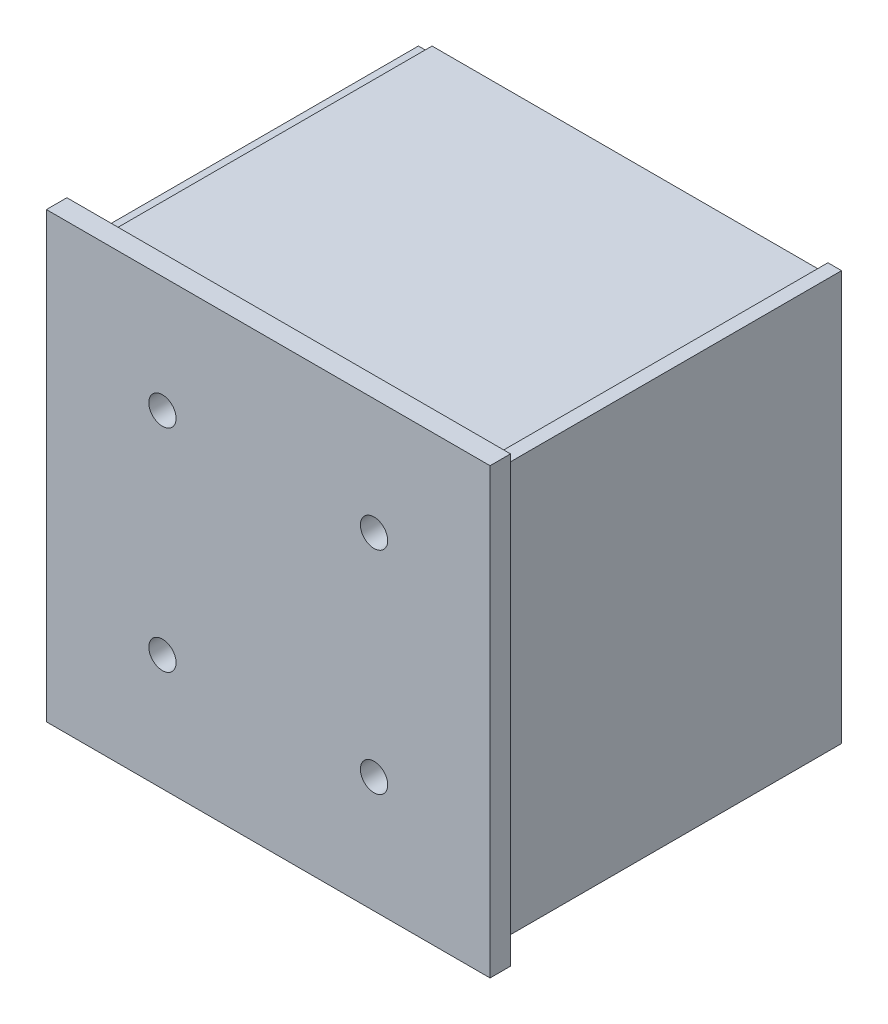
ISO-10303-21;
HEADER;
FILE_DESCRIPTION(('STEP AP214'),'2;1');
FILE_NAME('part.step','',(''),(''),'','','');
FILE_SCHEMA(('AUTOMOTIVE_DESIGN { 1 0 10303 214 1 1 1 1 }'));
ENDSEC;
DATA;
#1=APPLICATION_CONTEXT('core data for automotive mechanical design processes');
#2=APPLICATION_PROTOCOL_DEFINITION('international standard','automotive_design',2000,#1);
#3=PRODUCT_CONTEXT('',#1,'mechanical');
#4=PRODUCT('Part','Part','',(#3));
#5=PRODUCT_RELATED_PRODUCT_CATEGORY('part','',(#4));
#6=PRODUCT_DEFINITION_FORMATION('','',#4);
#7=PRODUCT_DEFINITION_CONTEXT('part definition',#1,'design');
#8=PRODUCT_DEFINITION('design','',#6,#7);
#9=PRODUCT_DEFINITION_SHAPE('','',#8);
#10=(LENGTH_UNIT() NAMED_UNIT(*) SI_UNIT(.MILLI.,.METRE.));
#11=(NAMED_UNIT(*) PLANE_ANGLE_UNIT() SI_UNIT($,.RADIAN.));
#12=(NAMED_UNIT(*) SI_UNIT($,.STERADIAN.) SOLID_ANGLE_UNIT());
#13=UNCERTAINTY_MEASURE_WITH_UNIT(LENGTH_MEASURE(1.E-05),#10,'distance_accuracy_value','');
#14=(GEOMETRIC_REPRESENTATION_CONTEXT(3) GLOBAL_UNCERTAINTY_ASSIGNED_CONTEXT((#13)) GLOBAL_UNIT_ASSIGNED_CONTEXT((#10,
#11,#12)) REPRESENTATION_CONTEXT('',''));
#15=CARTESIAN_POINT('',(0.,0.,0.));
#16=DIRECTION('',(0.,0.,1.));
#17=DIRECTION('',(1.,0.,0.));
#18=AXIS2_PLACEMENT_3D('',#15,#16,#17);
#19=CARTESIAN_POINT('',(0.,0.,0.));
#20=DIRECTION('',(0.,0.,1.));
#21=DIRECTION('',(1.,0.,0.));
#22=AXIS2_PLACEMENT_3D('',#19,#20,#21);
#23=PLANE('',#22);
#24=CARTESIAN_POINT('',(-15.5,15.5,0.));
#25=DIRECTION('',(0.,0.,1.));
#26=DIRECTION('',(1.,0.,0.));
#27=AXIS2_PLACEMENT_3D('',#24,#25,#26);
#28=CIRCLE('',#27,2.);
#29=CARTESIAN_POINT('',(-13.5,15.5,0.));
#30=VERTEX_POINT('',#29);
#31=EDGE_CURVE('E379',#30,#30,#28,.T.);
#32=ORIENTED_EDGE('',*,*,#31,.T.);
#33=EDGE_LOOP('',(#32));
#34=FACE_BOUND('',#33,.T.);
#35=CARTESIAN_POINT('',(15.5,15.5,0.));
#36=DIRECTION('',(0.,0.,1.));
#37=DIRECTION('',(1.,0.,0.));
#38=AXIS2_PLACEMENT_3D('',#35,#36,#37);
#39=CIRCLE('',#38,2.00000000000001);
#40=CARTESIAN_POINT('',(17.5,15.5,0.));
#41=VERTEX_POINT('',#40);
#42=EDGE_CURVE('E371',#41,#41,#39,.T.);
#43=ORIENTED_EDGE('',*,*,#42,.T.);
#44=EDGE_LOOP('',(#43));
#45=FACE_BOUND('',#44,.T.);
#46=CARTESIAN_POINT('',(15.5,-15.5,0.));
#47=DIRECTION('',(0.,0.,1.));
#48=DIRECTION('',(1.,0.,0.));
#49=AXIS2_PLACEMENT_3D('',#46,#47,#48);
#50=CIRCLE('',#49,2.00000000000001);
#51=CARTESIAN_POINT('',(17.5,-15.5,0.));
#52=VERTEX_POINT('',#51);
#53=EDGE_CURVE('E363',#52,#52,#50,.T.);
#54=ORIENTED_EDGE('',*,*,#53,.T.);
#55=EDGE_LOOP('',(#54));
#56=FACE_BOUND('',#55,.T.);
#57=CARTESIAN_POINT('',(-15.5,-15.5,0.));
#58=DIRECTION('',(0.,0.,1.));
#59=DIRECTION('',(1.,0.,0.));
#60=AXIS2_PLACEMENT_3D('',#57,#58,#59);
#61=CIRCLE('',#60,2.);
#62=CARTESIAN_POINT('',(-13.5,-15.5,0.));
#63=VERTEX_POINT('',#62);
#64=EDGE_CURVE('E350',#63,#63,#61,.T.);
#65=ORIENTED_EDGE('',*,*,#64,.T.);
#66=EDGE_LOOP('',(#65));
#67=FACE_BOUND('',#66,.T.);
#68=DIRECTION('',(-1.,0.,0.));
#69=VECTOR('',#68,1.);
#70=CARTESIAN_POINT('',(0.,26.5,0.));
#71=LINE('',#70,#69);
#72=CARTESIAN_POINT('',(29.,26.5,0.));
#73=VERTEX_POINT('',#72);
#74=CARTESIAN_POINT('',(-29.,26.5,0.));
#75=VERTEX_POINT('',#74);
#76=EDGE_CURVE('E203',#73,#75,#71,.T.);
#77=ORIENTED_EDGE('',*,*,#76,.F.);
#78=DIRECTION('',(0.,1.,0.));
#79=VECTOR('',#78,1.);
#80=CARTESIAN_POINT('',(29.,0.,0.));
#81=LINE('',#80,#79);
#82=CARTESIAN_POINT('',(29.,-26.5,0.));
#83=VERTEX_POINT('',#82);
#84=EDGE_CURVE('E264',#83,#73,#81,.T.);
#85=ORIENTED_EDGE('',*,*,#84,.F.);
#86=DIRECTION('',(-1.,0.,0.));
#87=VECTOR('',#86,1.);
#88=CARTESIAN_POINT('',(0.,-26.5,0.));
#89=LINE('',#88,#87);
#90=CARTESIAN_POINT('',(-29.,-26.5,0.));
#91=VERTEX_POINT('',#90);
#92=EDGE_CURVE('E68',#83,#91,#89,.T.);
#93=ORIENTED_EDGE('',*,*,#92,.T.);
#94=DIRECTION('',(0.,1.,0.));
#95=VECTOR('',#94,1.);
#96=CARTESIAN_POINT('',(-29.,0.,0.));
#97=LINE('',#96,#95);
#98=EDGE_CURVE('E63',#91,#75,#97,.T.);
#99=ORIENTED_EDGE('',*,*,#98,.T.);
#100=EDGE_LOOP('',(#77,#85,#93,#99));
#101=FACE_BOUND('',#100,.T.);
#102=ADVANCED_FACE('F47',(#34,#45,#56,#67,#101),#23,.F.);
#103=CARTESIAN_POINT('',(0.,0.,3.));
#104=DIRECTION('',(0.,0.,1.));
#105=DIRECTION('',(1.,0.,0.));
#106=AXIS2_PLACEMENT_3D('',#103,#104,#105);
#107=PLANE('',#106);
#108=CARTESIAN_POINT('',(15.5,-15.5,3.));
#109=DIRECTION('',(0.,0.,1.));
#110=DIRECTION('',(1.,0.,0.));
#111=AXIS2_PLACEMENT_3D('',#108,#109,#110);
#112=CIRCLE('',#111,2.00000000000001);
#113=CARTESIAN_POINT('',(17.5,-15.5,3.));
#114=VERTEX_POINT('',#113);
#115=EDGE_CURVE('E367',#114,#114,#112,.T.);
#116=ORIENTED_EDGE('',*,*,#115,.F.);
#117=EDGE_LOOP('',(#116));
#118=FACE_BOUND('',#117,.T.);
#119=CARTESIAN_POINT('',(-15.5,15.5,3.));
#120=DIRECTION('',(0.,0.,1.));
#121=DIRECTION('',(1.,0.,0.));
#122=AXIS2_PLACEMENT_3D('',#119,#120,#121);
#123=CIRCLE('',#122,2.);
#124=CARTESIAN_POINT('',(-13.5,15.5,3.));
#125=VERTEX_POINT('',#124);
#126=EDGE_CURVE('E383',#125,#125,#123,.T.);
#127=ORIENTED_EDGE('',*,*,#126,.F.);
#128=EDGE_LOOP('',(#127));
#129=FACE_BOUND('',#128,.T.);
#130=DIRECTION('',(0.,1.,0.));
#131=VECTOR('',#130,1.);
#132=CARTESIAN_POINT('',(32.5,32.5,3.));
#133=LINE('',#132,#131);
#134=CARTESIAN_POINT('',(32.5,-32.5,3.));
#135=VERTEX_POINT('',#134);
#136=CARTESIAN_POINT('',(32.5,32.5,3.));
#137=VERTEX_POINT('',#136);
#138=EDGE_CURVE('E391',#135,#137,#133,.T.);
#139=ORIENTED_EDGE('',*,*,#138,.T.);
#140=DIRECTION('',(-1.,0.,0.));
#141=VECTOR('',#140,1.);
#142=CARTESIAN_POINT('',(-32.5,32.5,3.));
#143=LINE('',#142,#141);
#144=CARTESIAN_POINT('',(-32.5,32.5,3.));
#145=VERTEX_POINT('',#144);
#146=EDGE_CURVE('E395',#137,#145,#143,.T.);
#147=ORIENTED_EDGE('',*,*,#146,.T.);
#148=DIRECTION('',(0.,-1.,0.));
#149=VECTOR('',#148,1.);
#150=CARTESIAN_POINT('',(-32.5,32.5,3.));
#151=LINE('',#150,#149);
#152=CARTESIAN_POINT('',(-32.5,-32.5,3.));
#153=VERTEX_POINT('',#152);
#154=EDGE_CURVE('E399',#145,#153,#151,.T.);
#155=ORIENTED_EDGE('',*,*,#154,.T.);
#156=DIRECTION('',(1.,0.,0.));
#157=VECTOR('',#156,1.);
#158=CARTESIAN_POINT('',(-32.5,-32.5,3.));
#159=LINE('',#158,#157);
#160=EDGE_CURVE('E402',#153,#135,#159,.T.);
#161=ORIENTED_EDGE('',*,*,#160,.T.);
#162=EDGE_LOOP('',(#139,#147,#155,#161));
#163=FACE_BOUND('',#162,.T.);
#164=CARTESIAN_POINT('',(15.5,15.5,3.));
#165=DIRECTION('',(0.,0.,1.));
#166=DIRECTION('',(1.,0.,0.));
#167=AXIS2_PLACEMENT_3D('',#164,#165,#166);
#168=CIRCLE('',#167,2.00000000000001);
#169=CARTESIAN_POINT('',(17.5,15.5,3.));
#170=VERTEX_POINT('',#169);
#171=EDGE_CURVE('E375',#170,#170,#168,.T.);
#172=ORIENTED_EDGE('',*,*,#171,.F.);
#173=EDGE_LOOP('',(#172));
#174=FACE_BOUND('',#173,.T.);
#175=CARTESIAN_POINT('',(-15.5,-15.5,3.));
#176=DIRECTION('',(0.,0.,1.));
#177=DIRECTION('',(1.,0.,0.));
#178=AXIS2_PLACEMENT_3D('',#175,#176,#177);
#179=CIRCLE('',#178,2.);
#180=CARTESIAN_POINT('',(-13.5,-15.5,3.));
#181=VERTEX_POINT('',#180);
#182=EDGE_CURVE('E359',#181,#181,#179,.T.);
#183=ORIENTED_EDGE('',*,*,#182,.F.);
#184=EDGE_LOOP('',(#183));
#185=FACE_BOUND('',#184,.T.);
#186=ADVANCED_FACE('F444',(#118,#129,#163,#174,#185),#107,.T.);
#187=DIRECTION('',(1.,0.,0.));
#188=VECTOR('',#187,1.);
#189=CARTESIAN_POINT('',(0.,-30.,0.));
#190=LINE('',#189,#188);
#191=CARTESIAN_POINT('',(29.,-30.,0.));
#192=VERTEX_POINT('',#191);
#193=CARTESIAN_POINT('',(31.,-30.,0.));
#194=VERTEX_POINT('',#193);
#195=EDGE_CURVE('E273',#192,#194,#190,.T.);
#196=ORIENTED_EDGE('',*,*,#195,.T.);
#197=DIRECTION('',(0.,1.,0.));
#198=VECTOR('',#197,1.);
#199=CARTESIAN_POINT('',(31.,0.,0.));
#200=LINE('',#199,#198);
#201=CARTESIAN_POINT('',(31.,30.,0.));
#202=VERTEX_POINT('',#201);
#203=EDGE_CURVE('E268',#194,#202,#200,.T.);
#204=ORIENTED_EDGE('',*,*,#203,.T.);
#205=DIRECTION('',(1.,0.,0.));
#206=VECTOR('',#205,1.);
#207=CARTESIAN_POINT('',(0.,30.,0.));
#208=LINE('',#207,#206);
#209=CARTESIAN_POINT('',(29.,30.,0.));
#210=VERTEX_POINT('',#209);
#211=EDGE_CURVE('E198',#210,#202,#208,.T.);
#212=ORIENTED_EDGE('',*,*,#211,.F.);
#213=CARTESIAN_POINT('',(29.,28.5,0.));
#214=VERTEX_POINT('',#213);
#215=EDGE_CURVE('E269',#214,#210,#81,.T.);
#216=ORIENTED_EDGE('',*,*,#215,.F.);
#217=DIRECTION('',(-1.,0.,0.));
#218=VECTOR('',#217,1.);
#219=CARTESIAN_POINT('',(0.,28.5,0.));
#220=LINE('',#219,#218);
#221=CARTESIAN_POINT('',(-29.,28.5,0.));
#222=VERTEX_POINT('',#221);
#223=EDGE_CURVE('E297',#214,#222,#220,.T.);
#224=ORIENTED_EDGE('',*,*,#223,.T.);
#225=DIRECTION('',(0.,-1.,0.));
#226=VECTOR('',#225,1.);
#227=CARTESIAN_POINT('',(-29.,0.,0.));
#228=LINE('',#227,#226);
#229=CARTESIAN_POINT('',(-29.,27.5,0.));
#230=VERTEX_POINT('',#229);
#231=EDGE_CURVE('E294',#222,#230,#228,.T.);
#232=ORIENTED_EDGE('',*,*,#231,.T.);
#233=DIRECTION('',(1.,0.,0.));
#234=VECTOR('',#233,1.);
#235=CARTESIAN_POINT('',(0.,27.5,0.));
#236=LINE('',#235,#234);
#237=CARTESIAN_POINT('',(-31.,27.5,0.));
#238=VERTEX_POINT('',#237);
#239=EDGE_CURVE('E290',#238,#230,#236,.T.);
#240=ORIENTED_EDGE('',*,*,#239,.F.);
#241=DIRECTION('',(0.,1.,0.));
#242=VECTOR('',#241,1.);
#243=CARTESIAN_POINT('',(-31.,0.,0.));
#244=LINE('',#243,#242);
#245=CARTESIAN_POINT('',(-31.,-27.5,0.));
#246=VERTEX_POINT('',#245);
#247=EDGE_CURVE('E286',#246,#238,#244,.T.);
#248=ORIENTED_EDGE('',*,*,#247,.F.);
#249=DIRECTION('',(1.,0.,0.));
#250=VECTOR('',#249,1.);
#251=CARTESIAN_POINT('',(0.,-27.5,0.));
#252=LINE('',#251,#250);
#253=CARTESIAN_POINT('',(-29.,-27.5,0.));
#254=VERTEX_POINT('',#253);
#255=EDGE_CURVE('E283',#246,#254,#252,.T.);
#256=ORIENTED_EDGE('',*,*,#255,.T.);
#257=DIRECTION('',(0.,-1.,0.));
#258=VECTOR('',#257,1.);
#259=CARTESIAN_POINT('',(-29.,0.,0.));
#260=LINE('',#259,#258);
#261=CARTESIAN_POINT('',(-29.,-28.5,0.));
#262=VERTEX_POINT('',#261);
#263=EDGE_CURVE('E280',#254,#262,#260,.T.);
#264=ORIENTED_EDGE('',*,*,#263,.T.);
#265=DIRECTION('',(-1.,0.,0.));
#266=VECTOR('',#265,1.);
#267=CARTESIAN_POINT('',(0.,-28.5,0.));
#268=LINE('',#267,#266);
#269=CARTESIAN_POINT('',(29.,-28.5,0.));
#270=VERTEX_POINT('',#269);
#271=EDGE_CURVE('E276',#270,#262,#268,.T.);
#272=ORIENTED_EDGE('',*,*,#271,.F.);
#273=EDGE_CURVE('E270',#192,#270,#81,.T.);
#274=ORIENTED_EDGE('',*,*,#273,.F.);
#275=EDGE_LOOP('',(#196,#204,#212,#216,#224,#232,#240,#248,#256,#264,#272,#274));
#276=FACE_BOUND('',#275,.T.);
#277=DIRECTION('',(0.,1.,0.));
#278=VECTOR('',#277,1.);
#279=CARTESIAN_POINT('',(32.5,32.5,0.));
#280=LINE('',#279,#278);
#281=CARTESIAN_POINT('',(32.5,-32.5,0.));
#282=VERTEX_POINT('',#281);
#283=CARTESIAN_POINT('',(32.5,32.5,0.));
#284=VERTEX_POINT('',#283);
#285=EDGE_CURVE('E387',#282,#284,#280,.T.);
#286=ORIENTED_EDGE('',*,*,#285,.F.);
#287=DIRECTION('',(1.,0.,0.));
#288=VECTOR('',#287,1.);
#289=CARTESIAN_POINT('',(-32.5,-32.5,0.));
#290=LINE('',#289,#288);
#291=CARTESIAN_POINT('',(-32.5,-32.5,0.));
#292=VERTEX_POINT('',#291);
#293=EDGE_CURVE('E396',#292,#282,#290,.T.);
#294=ORIENTED_EDGE('',*,*,#293,.F.);
#295=DIRECTION('',(0.,-1.,0.));
#296=VECTOR('',#295,1.);
#297=CARTESIAN_POINT('',(-32.5,32.5,0.));
#298=LINE('',#297,#296);
#299=CARTESIAN_POINT('',(-32.5,32.5,0.));
#300=VERTEX_POINT('',#299);
#301=EDGE_CURVE('E412',#300,#292,#298,.T.);
#302=ORIENTED_EDGE('',*,*,#301,.F.);
#303=DIRECTION('',(-1.,0.,0.));
#304=VECTOR('',#303,1.);
#305=CARTESIAN_POINT('',(-32.5,32.5,0.));
#306=LINE('',#305,#304);
#307=EDGE_CURVE('E409',#284,#300,#306,.T.);
#308=ORIENTED_EDGE('',*,*,#307,.F.);
#309=EDGE_LOOP('',(#286,#294,#302,#308));
#310=FACE_BOUND('',#309,.T.);
#311=ADVANCED_FACE('F435',(#276,#310),#23,.F.);
#312=CARTESIAN_POINT('',(32.5,32.5,3.));
#313=DIRECTION('',(-1.,0.,0.));
#314=DIRECTION('',(0.,0.,1.));
#315=AXIS2_PLACEMENT_3D('',#312,#313,#314);
#316=PLANE('',#315);
#317=ORIENTED_EDGE('',*,*,#285,.T.);
#318=DIRECTION('',(0.,0.,-1.));
#319=VECTOR('',#318,1.);
#320=CARTESIAN_POINT('',(32.5,32.5,3.));
#321=LINE('',#320,#319);
#322=EDGE_CURVE('E11',#137,#284,#321,.T.);
#323=ORIENTED_EDGE('',*,*,#322,.F.);
#324=ORIENTED_EDGE('',*,*,#138,.F.);
#325=DIRECTION('',(0.,0.,-1.));
#326=VECTOR('',#325,1.);
#327=CARTESIAN_POINT('',(32.5,-32.5,3.));
#328=LINE('',#327,#326);
#329=EDGE_CURVE('E405',#135,#282,#328,.T.);
#330=ORIENTED_EDGE('',*,*,#329,.T.);
#331=EDGE_LOOP('',(#317,#323,#324,#330));
#332=FACE_BOUND('',#331,.T.);
#333=ADVANCED_FACE('F49',(#332),#316,.F.);
#334=CARTESIAN_POINT('',(-32.5,32.5,3.));
#335=DIRECTION('',(0.,-1.,0.));
#336=DIRECTION('',(0.,0.,-1.));
#337=AXIS2_PLACEMENT_3D('',#334,#335,#336);
#338=PLANE('',#337);
#339=ORIENTED_EDGE('',*,*,#307,.T.);
#340=DIRECTION('',(0.,0.,-1.));
#341=VECTOR('',#340,1.);
#342=CARTESIAN_POINT('',(-32.5,32.5,3.));
#343=LINE('',#342,#341);
#344=EDGE_CURVE('E56',#145,#300,#343,.T.);
#345=ORIENTED_EDGE('',*,*,#344,.F.);
#346=ORIENTED_EDGE('',*,*,#146,.F.);
#347=ORIENTED_EDGE('',*,*,#322,.T.);
#348=EDGE_LOOP('',(#339,#345,#346,#347));
#349=FACE_BOUND('',#348,.T.);
#350=ADVANCED_FACE('F446',(#349),#338,.F.);
#351=CARTESIAN_POINT('',(-32.5,32.5,3.));
#352=DIRECTION('',(1.,0.,0.));
#353=DIRECTION('',(0.,0.,-1.));
#354=AXIS2_PLACEMENT_3D('',#351,#352,#353);
#355=PLANE('',#354);
#356=ORIENTED_EDGE('',*,*,#301,.T.);
#357=DIRECTION('',(0.,0.,-1.));
#358=VECTOR('',#357,1.);
#359=CARTESIAN_POINT('',(-32.5,-32.5,3.));
#360=LINE('',#359,#358);
#361=EDGE_CURVE('E420',#153,#292,#360,.T.);
#362=ORIENTED_EDGE('',*,*,#361,.F.);
#363=ORIENTED_EDGE('',*,*,#154,.F.);
#364=ORIENTED_EDGE('',*,*,#344,.T.);
#365=EDGE_LOOP('',(#356,#362,#363,#364));
#366=FACE_BOUND('',#365,.T.);
#367=ADVANCED_FACE('F429',(#366),#355,.F.);
#368=CARTESIAN_POINT('',(-32.5,-32.5,3.));
#369=DIRECTION('',(0.,1.,0.));
#370=DIRECTION('',(0.,0.,1.));
#371=AXIS2_PLACEMENT_3D('',#368,#369,#370);
#372=PLANE('',#371);
#373=ORIENTED_EDGE('',*,*,#293,.T.);
#374=ORIENTED_EDGE('',*,*,#329,.F.);
#375=ORIENTED_EDGE('',*,*,#160,.F.);
#376=ORIENTED_EDGE('',*,*,#361,.T.);
#377=EDGE_LOOP('',(#373,#374,#375,#376));
#378=FACE_BOUND('',#377,.T.);
#379=ADVANCED_FACE('F438',(#378),#372,.F.);
#380=CARTESIAN_POINT('',(-15.5,15.5,3.));
#381=DIRECTION('',(0.,0.,-1.));
#382=DIRECTION('',(-1.,0.,0.));
#383=AXIS2_PLACEMENT_3D('',#380,#381,#382);
#384=CYLINDRICAL_SURFACE('',#383,2.);
#385=ORIENTED_EDGE('',*,*,#126,.T.);
#386=EDGE_LOOP('',(#385));
#387=FACE_BOUND('',#386,.T.);
#388=ORIENTED_EDGE('',*,*,#31,.F.);
#389=EDGE_LOOP('',(#388));
#390=FACE_BOUND('',#389,.T.);
#391=ADVANCED_FACE('F567',(#387,#390),#384,.F.);
#392=CARTESIAN_POINT('',(15.5,15.5,3.));
#393=DIRECTION('',(0.,0.,-1.));
#394=DIRECTION('',(-1.,0.,0.));
#395=AXIS2_PLACEMENT_3D('',#392,#393,#394);
#396=CYLINDRICAL_SURFACE('',#395,2.00000000000001);
#397=ORIENTED_EDGE('',*,*,#171,.T.);
#398=EDGE_LOOP('',(#397));
#399=FACE_BOUND('',#398,.T.);
#400=ORIENTED_EDGE('',*,*,#42,.F.);
#401=EDGE_LOOP('',(#400));
#402=FACE_BOUND('',#401,.T.);
#403=ADVANCED_FACE('F563',(#399,#402),#396,.F.);
#404=CARTESIAN_POINT('',(15.5,-15.5,3.));
#405=DIRECTION('',(0.,0.,-1.));
#406=DIRECTION('',(-1.,0.,0.));
#407=AXIS2_PLACEMENT_3D('',#404,#405,#406);
#408=CYLINDRICAL_SURFACE('',#407,2.00000000000001);
#409=ORIENTED_EDGE('',*,*,#115,.T.);
#410=EDGE_LOOP('',(#409));
#411=FACE_BOUND('',#410,.T.);
#412=ORIENTED_EDGE('',*,*,#53,.F.);
#413=EDGE_LOOP('',(#412));
#414=FACE_BOUND('',#413,.T.);
#415=ADVANCED_FACE('F559',(#411,#414),#408,.F.);
#416=CARTESIAN_POINT('',(-15.5,-15.5,3.));
#417=DIRECTION('',(0.,0.,-1.));
#418=DIRECTION('',(-1.,0.,0.));
#419=AXIS2_PLACEMENT_3D('',#416,#417,#418);
#420=CYLINDRICAL_SURFACE('',#419,2.);
#421=ORIENTED_EDGE('',*,*,#182,.T.);
#422=EDGE_LOOP('',(#421));
#423=FACE_BOUND('',#422,.T.);
#424=ORIENTED_EDGE('',*,*,#64,.F.);
#425=EDGE_LOOP('',(#424));
#426=FACE_BOUND('',#425,.T.);
#427=ADVANCED_FACE('F549',(#423,#426),#420,.F.);
#428=CARTESIAN_POINT('',(31.,0.,-50.));
#429=DIRECTION('',(1.,0.,0.));
#430=DIRECTION('',(0.,0.,-1.));
#431=AXIS2_PLACEMENT_3D('',#428,#429,#430);
#432=PLANE('',#431);
#433=ORIENTED_EDGE('',*,*,#203,.F.);
#434=DIRECTION('',(0.,0.,1.));
#435=VECTOR('',#434,1.);
#436=CARTESIAN_POINT('',(31.,-30.,-50.));
#437=LINE('',#436,#435);
#438=CARTESIAN_POINT('',(31.,-30.,-50.));
#439=VERTEX_POINT('',#438);
#440=EDGE_CURVE('E346',#439,#194,#437,.T.);
#441=ORIENTED_EDGE('',*,*,#440,.F.);
#442=DIRECTION('',(0.,1.,0.));
#443=VECTOR('',#442,1.);
#444=CARTESIAN_POINT('',(31.,0.,-50.));
#445=LINE('',#444,#443);
#446=CARTESIAN_POINT('',(31.,30.,-50.));
#447=VERTEX_POINT('',#446);
#448=EDGE_CURVE('E218',#439,#447,#445,.T.);
#449=ORIENTED_EDGE('',*,*,#448,.T.);
#450=DIRECTION('',(0.,0.,1.));
#451=VECTOR('',#450,1.);
#452=CARTESIAN_POINT('',(31.,30.,-50.));
#453=LINE('',#452,#451);
#454=EDGE_CURVE('E206',#447,#202,#453,.T.);
#455=ORIENTED_EDGE('',*,*,#454,.T.);
#456=EDGE_LOOP('',(#433,#441,#449,#455));
#457=FACE_BOUND('',#456,.T.);
#458=ADVANCED_FACE('F477',(#457),#432,.T.);
#459=CARTESIAN_POINT('',(0.,-30.,-50.));
#460=DIRECTION('',(0.,-1.,0.));
#461=DIRECTION('',(0.,0.,-1.));
#462=AXIS2_PLACEMENT_3D('',#459,#460,#461);
#463=PLANE('',#462);
#464=ORIENTED_EDGE('',*,*,#195,.F.);
#465=DIRECTION('',(0.,0.,1.));
#466=VECTOR('',#465,1.);
#467=CARTESIAN_POINT('',(29.,-30.,-50.));
#468=LINE('',#467,#466);
#469=CARTESIAN_POINT('',(29.,-30.,-50.));
#470=VERTEX_POINT('',#469);
#471=EDGE_CURVE('E342',#470,#192,#468,.T.);
#472=ORIENTED_EDGE('',*,*,#471,.F.);
#473=DIRECTION('',(1.,0.,0.));
#474=VECTOR('',#473,1.);
#475=CARTESIAN_POINT('',(0.,-30.,-50.));
#476=LINE('',#475,#474);
#477=EDGE_CURVE('E224',#470,#439,#476,.T.);
#478=ORIENTED_EDGE('',*,*,#477,.T.);
#479=ORIENTED_EDGE('',*,*,#440,.T.);
#480=EDGE_LOOP('',(#464,#472,#478,#479));
#481=FACE_BOUND('',#480,.T.);
#482=ADVANCED_FACE('F473',(#481),#463,.T.);
#483=CARTESIAN_POINT('',(29.,0.,-50.));
#484=DIRECTION('',(1.,0.,0.));
#485=DIRECTION('',(0.,0.,-1.));
#486=AXIS2_PLACEMENT_3D('',#483,#484,#485);
#487=PLANE('',#486);
#488=ORIENTED_EDGE('',*,*,#273,.T.);
#489=DIRECTION('',(0.,0.,1.));
#490=VECTOR('',#489,1.);
#491=CARTESIAN_POINT('',(29.,-28.5,-50.));
#492=LINE('',#491,#490);
#493=CARTESIAN_POINT('',(29.,-28.5,-50.));
#494=VERTEX_POINT('',#493);
#495=EDGE_CURVE('E338',#494,#270,#492,.T.);
#496=ORIENTED_EDGE('',*,*,#495,.F.);
#497=DIRECTION('',(0.,1.,0.));
#498=VECTOR('',#497,1.);
#499=CARTESIAN_POINT('',(29.,0.,-50.));
#500=LINE('',#499,#498);
#501=EDGE_CURVE('E220',#470,#494,#500,.T.);
#502=ORIENTED_EDGE('',*,*,#501,.F.);
#503=ORIENTED_EDGE('',*,*,#471,.T.);
#504=EDGE_LOOP('',(#488,#496,#502,#503));
#505=FACE_BOUND('',#504,.T.);
#506=ADVANCED_FACE('F518',(#505),#487,.F.);
#507=CARTESIAN_POINT('',(0.,-28.5,-50.));
#508=DIRECTION('',(0.,1.,0.));
#509=DIRECTION('',(0.,0.,1.));
#510=AXIS2_PLACEMENT_3D('',#507,#508,#509);
#511=PLANE('',#510);
#512=ORIENTED_EDGE('',*,*,#271,.T.);
#513=DIRECTION('',(0.,0.,1.));
#514=VECTOR('',#513,1.);
#515=CARTESIAN_POINT('',(-29.,-28.5,-50.));
#516=LINE('',#515,#514);
#517=CARTESIAN_POINT('',(-29.,-28.5,-50.));
#518=VERTEX_POINT('',#517);
#519=EDGE_CURVE('E334',#518,#262,#516,.T.);
#520=ORIENTED_EDGE('',*,*,#519,.F.);
#521=DIRECTION('',(-1.,0.,0.));
#522=VECTOR('',#521,1.);
#523=CARTESIAN_POINT('',(0.,-28.5,-50.));
#524=LINE('',#523,#522);
#525=EDGE_CURVE('E228',#494,#518,#524,.T.);
#526=ORIENTED_EDGE('',*,*,#525,.F.);
#527=ORIENTED_EDGE('',*,*,#495,.T.);
#528=EDGE_LOOP('',(#512,#520,#526,#527));
#529=FACE_BOUND('',#528,.T.);
#530=ADVANCED_FACE('F513',(#529),#511,.F.);
#531=CARTESIAN_POINT('',(-29.,0.,-50.));
#532=DIRECTION('',(-1.,0.,0.));
#533=DIRECTION('',(0.,0.,1.));
#534=AXIS2_PLACEMENT_3D('',#531,#532,#533);
#535=PLANE('',#534);
#536=ORIENTED_EDGE('',*,*,#263,.F.);
#537=DIRECTION('',(0.,0.,1.));
#538=VECTOR('',#537,1.);
#539=CARTESIAN_POINT('',(-29.,-27.5,-50.));
#540=LINE('',#539,#538);
#541=CARTESIAN_POINT('',(-29.,-27.5,-50.));
#542=VERTEX_POINT('',#541);
#543=EDGE_CURVE('E330',#542,#254,#540,.T.);
#544=ORIENTED_EDGE('',*,*,#543,.F.);
#545=DIRECTION('',(0.,-1.,0.));
#546=VECTOR('',#545,1.);
#547=CARTESIAN_POINT('',(-29.,0.,-50.));
#548=LINE('',#547,#546);
#549=EDGE_CURVE('E231',#542,#518,#548,.T.);
#550=ORIENTED_EDGE('',*,*,#549,.T.);
#551=ORIENTED_EDGE('',*,*,#519,.T.);
#552=EDGE_LOOP('',(#536,#544,#550,#551));
#553=FACE_BOUND('',#552,.T.);
#554=ADVANCED_FACE('F510',(#553),#535,.T.);
#555=CARTESIAN_POINT('',(0.,-27.5,-50.));
#556=DIRECTION('',(0.,-1.,0.));
#557=DIRECTION('',(0.,0.,-1.));
#558=AXIS2_PLACEMENT_3D('',#555,#556,#557);
#559=PLANE('',#558);
#560=ORIENTED_EDGE('',*,*,#255,.F.);
#561=DIRECTION('',(0.,0.,1.));
#562=VECTOR('',#561,1.);
#563=CARTESIAN_POINT('',(-31.,-27.5,-50.));
#564=LINE('',#563,#562);
#565=CARTESIAN_POINT('',(-31.,-27.5,-50.));
#566=VERTEX_POINT('',#565);
#567=EDGE_CURVE('E326',#566,#246,#564,.T.);
#568=ORIENTED_EDGE('',*,*,#567,.F.);
#569=DIRECTION('',(1.,0.,0.));
#570=VECTOR('',#569,1.);
#571=CARTESIAN_POINT('',(0.,-27.5,-50.));
#572=LINE('',#571,#570);
#573=EDGE_CURVE('E235',#566,#542,#572,.T.);
#574=ORIENTED_EDGE('',*,*,#573,.T.);
#575=ORIENTED_EDGE('',*,*,#543,.T.);
#576=EDGE_LOOP('',(#560,#568,#574,#575));
#577=FACE_BOUND('',#576,.T.);
#578=ADVANCED_FACE('F506',(#577),#559,.T.);
#579=CARTESIAN_POINT('',(-31.,0.,-50.));
#580=DIRECTION('',(1.,0.,0.));
#581=DIRECTION('',(0.,0.,-1.));
#582=AXIS2_PLACEMENT_3D('',#579,#580,#581);
#583=PLANE('',#582);
#584=ORIENTED_EDGE('',*,*,#247,.T.);
#585=DIRECTION('',(0.,0.,1.));
#586=VECTOR('',#585,1.);
#587=CARTESIAN_POINT('',(-31.,27.5,-50.));
#588=LINE('',#587,#586);
#589=CARTESIAN_POINT('',(-31.,27.5,-50.));
#590=VERTEX_POINT('',#589);
#591=EDGE_CURVE('E322',#590,#238,#588,.T.);
#592=ORIENTED_EDGE('',*,*,#591,.F.);
#593=DIRECTION('',(0.,1.,0.));
#594=VECTOR('',#593,1.);
#595=CARTESIAN_POINT('',(-31.,0.,-50.));
#596=LINE('',#595,#594);
#597=EDGE_CURVE('E239',#566,#590,#596,.T.);
#598=ORIENTED_EDGE('',*,*,#597,.F.);
#599=ORIENTED_EDGE('',*,*,#567,.T.);
#600=EDGE_LOOP('',(#584,#592,#598,#599));
#601=FACE_BOUND('',#600,.T.);
#602=ADVANCED_FACE('F502',(#601),#583,.F.);
#603=CARTESIAN_POINT('',(0.,27.5,-50.));
#604=DIRECTION('',(0.,-1.,0.));
#605=DIRECTION('',(0.,0.,-1.));
#606=AXIS2_PLACEMENT_3D('',#603,#604,#605);
#607=PLANE('',#606);
#608=ORIENTED_EDGE('',*,*,#239,.T.);
#609=DIRECTION('',(0.,0.,1.));
#610=VECTOR('',#609,1.);
#611=CARTESIAN_POINT('',(-29.,27.5,-50.));
#612=LINE('',#611,#610);
#613=CARTESIAN_POINT('',(-29.,27.5,-50.));
#614=VERTEX_POINT('',#613);
#615=EDGE_CURVE('E318',#614,#230,#612,.T.);
#616=ORIENTED_EDGE('',*,*,#615,.F.);
#617=DIRECTION('',(1.,0.,0.));
#618=VECTOR('',#617,1.);
#619=CARTESIAN_POINT('',(0.,27.5,-50.));
#620=LINE('',#619,#618);
#621=EDGE_CURVE('E243',#590,#614,#620,.T.);
#622=ORIENTED_EDGE('',*,*,#621,.F.);
#623=ORIENTED_EDGE('',*,*,#591,.T.);
#624=EDGE_LOOP('',(#608,#616,#622,#623));
#625=FACE_BOUND('',#624,.T.);
#626=ADVANCED_FACE('F499',(#625),#607,.F.);
#627=CARTESIAN_POINT('',(-29.,0.,-50.));
#628=DIRECTION('',(-1.,0.,0.));
#629=DIRECTION('',(0.,0.,1.));
#630=AXIS2_PLACEMENT_3D('',#627,#628,#629);
#631=PLANE('',#630);
#632=ORIENTED_EDGE('',*,*,#231,.F.);
#633=DIRECTION('',(0.,0.,1.));
#634=VECTOR('',#633,1.);
#635=CARTESIAN_POINT('',(-29.,28.5,-50.));
#636=LINE('',#635,#634);
#637=CARTESIAN_POINT('',(-29.,28.5,-50.));
#638=VERTEX_POINT('',#637);
#639=EDGE_CURVE('E314',#638,#222,#636,.T.);
#640=ORIENTED_EDGE('',*,*,#639,.F.);
#641=DIRECTION('',(0.,-1.,0.));
#642=VECTOR('',#641,1.);
#643=CARTESIAN_POINT('',(-29.,0.,-50.));
#644=LINE('',#643,#642);
#645=EDGE_CURVE('E246',#638,#614,#644,.T.);
#646=ORIENTED_EDGE('',*,*,#645,.T.);
#647=ORIENTED_EDGE('',*,*,#615,.T.);
#648=EDGE_LOOP('',(#632,#640,#646,#647));
#649=FACE_BOUND('',#648,.T.);
#650=ADVANCED_FACE('F495',(#649),#631,.T.);
#651=CARTESIAN_POINT('',(0.,28.5,-50.));
#652=DIRECTION('',(0.,1.,0.));
#653=DIRECTION('',(0.,0.,1.));
#654=AXIS2_PLACEMENT_3D('',#651,#652,#653);
#655=PLANE('',#654);
#656=ORIENTED_EDGE('',*,*,#223,.F.);
#657=DIRECTION('',(0.,0.,1.));
#658=VECTOR('',#657,1.);
#659=CARTESIAN_POINT('',(29.,28.5,-50.));
#660=LINE('',#659,#658);
#661=CARTESIAN_POINT('',(29.,28.5,-50.));
#662=VERTEX_POINT('',#661);
#663=EDGE_CURVE('E310',#662,#214,#660,.T.);
#664=ORIENTED_EDGE('',*,*,#663,.F.);
#665=DIRECTION('',(-1.,0.,0.));
#666=VECTOR('',#665,1.);
#667=CARTESIAN_POINT('',(0.,28.5,-50.));
#668=LINE('',#667,#666);
#669=EDGE_CURVE('E250',#662,#638,#668,.T.);
#670=ORIENTED_EDGE('',*,*,#669,.T.);
#671=ORIENTED_EDGE('',*,*,#639,.T.);
#672=EDGE_LOOP('',(#656,#664,#670,#671));
#673=FACE_BOUND('',#672,.T.);
#674=ADVANCED_FACE('F491',(#673),#655,.T.);
#675=ORIENTED_EDGE('',*,*,#215,.T.);
#676=DIRECTION('',(0.,0.,1.));
#677=VECTOR('',#676,1.);
#678=CARTESIAN_POINT('',(29.,30.,-50.));
#679=LINE('',#678,#677);
#680=CARTESIAN_POINT('',(29.,30.,-50.));
#681=VERTEX_POINT('',#680);
#682=EDGE_CURVE('E306',#681,#210,#679,.T.);
#683=ORIENTED_EDGE('',*,*,#682,.F.);
#684=EDGE_CURVE('E219',#662,#681,#500,.T.);
#685=ORIENTED_EDGE('',*,*,#684,.F.);
#686=ORIENTED_EDGE('',*,*,#663,.T.);
#687=EDGE_LOOP('',(#675,#683,#685,#686));
#688=FACE_BOUND('',#687,.T.);
#689=ADVANCED_FACE('F487',(#688),#487,.F.);
#690=CARTESIAN_POINT('',(0.,26.5,-50.));
#691=DIRECTION('',(0.,1.,0.));
#692=DIRECTION('',(0.,0.,1.));
#693=AXIS2_PLACEMENT_3D('',#690,#691,#692);
#694=PLANE('',#693);
#695=ORIENTED_EDGE('',*,*,#76,.T.);
#696=DIRECTION('',(0.,0.,1.));
#697=VECTOR('',#696,1.);
#698=CARTESIAN_POINT('',(-29.,26.5,-50.));
#699=LINE('',#698,#697);
#700=CARTESIAN_POINT('',(-29.,26.5,-50.));
#701=VERTEX_POINT('',#700);
#702=EDGE_CURVE('E201',#701,#75,#699,.T.);
#703=ORIENTED_EDGE('',*,*,#702,.F.);
#704=DIRECTION('',(-1.,0.,0.));
#705=VECTOR('',#704,1.);
#706=CARTESIAN_POINT('',(0.,26.5,-50.));
#707=LINE('',#706,#705);
#708=CARTESIAN_POINT('',(29.,26.5,-50.));
#709=VERTEX_POINT('',#708);
#710=EDGE_CURVE('E184',#709,#701,#707,.T.);
#711=ORIENTED_EDGE('',*,*,#710,.F.);
#712=DIRECTION('',(0.,0.,1.));
#713=VECTOR('',#712,1.);
#714=CARTESIAN_POINT('',(29.,26.5,-50.));
#715=LINE('',#714,#713);
#716=EDGE_CURVE('E257',#709,#73,#715,.T.);
#717=ORIENTED_EDGE('',*,*,#716,.T.);
#718=EDGE_LOOP('',(#695,#703,#711,#717));
#719=FACE_BOUND('',#718,.T.);
#720=ADVANCED_FACE('F202',(#719),#694,.F.);
#721=CARTESIAN_POINT('',(-29.,0.,-50.));
#722=DIRECTION('',(1.,0.,0.));
#723=DIRECTION('',(0.,0.,-1.));
#724=AXIS2_PLACEMENT_3D('',#721,#722,#723);
#725=PLANE('',#724);
#726=ORIENTED_EDGE('',*,*,#98,.F.);
#727=DIRECTION('',(0.,0.,1.));
#728=VECTOR('',#727,1.);
#729=CARTESIAN_POINT('',(-29.,-26.5,-50.));
#730=LINE('',#729,#728);
#731=CARTESIAN_POINT('',(-29.,-26.5,-50.));
#732=VERTEX_POINT('',#731);
#733=EDGE_CURVE('E207',#732,#91,#730,.T.);
#734=ORIENTED_EDGE('',*,*,#733,.F.);
#735=DIRECTION('',(0.,1.,0.));
#736=VECTOR('',#735,1.);
#737=CARTESIAN_POINT('',(-29.,0.,-50.));
#738=LINE('',#737,#736);
#739=EDGE_CURVE('E190',#732,#701,#738,.T.);
#740=ORIENTED_EDGE('',*,*,#739,.T.);
#741=ORIENTED_EDGE('',*,*,#702,.T.);
#742=EDGE_LOOP('',(#726,#734,#740,#741));
#743=FACE_BOUND('',#742,.T.);
#744=ADVANCED_FACE('F209',(#743),#725,.T.);
#745=CARTESIAN_POINT('',(0.,-26.5,-50.));
#746=DIRECTION('',(0.,1.,0.));
#747=DIRECTION('',(0.,0.,1.));
#748=AXIS2_PLACEMENT_3D('',#745,#746,#747);
#749=PLANE('',#748);
#750=ORIENTED_EDGE('',*,*,#92,.F.);
#751=DIRECTION('',(0.,0.,1.));
#752=VECTOR('',#751,1.);
#753=CARTESIAN_POINT('',(29.,-26.5,-50.));
#754=LINE('',#753,#752);
#755=CARTESIAN_POINT('',(29.,-26.5,-50.));
#756=VERTEX_POINT('',#755);
#757=EDGE_CURVE('E353',#756,#83,#754,.T.);
#758=ORIENTED_EDGE('',*,*,#757,.F.);
#759=DIRECTION('',(-1.,0.,0.));
#760=VECTOR('',#759,1.);
#761=CARTESIAN_POINT('',(0.,-26.5,-50.));
#762=LINE('',#761,#760);
#763=EDGE_CURVE('E211',#756,#732,#762,.T.);
#764=ORIENTED_EDGE('',*,*,#763,.T.);
#765=ORIENTED_EDGE('',*,*,#733,.T.);
#766=EDGE_LOOP('',(#750,#758,#764,#765));
#767=FACE_BOUND('',#766,.T.);
#768=ADVANCED_FACE('F550',(#767),#749,.T.);
#769=ORIENTED_EDGE('',*,*,#84,.T.);
#770=ORIENTED_EDGE('',*,*,#716,.F.);
#771=EDGE_CURVE('E193',#756,#709,#500,.T.);
#772=ORIENTED_EDGE('',*,*,#771,.F.);
#773=ORIENTED_EDGE('',*,*,#757,.T.);
#774=EDGE_LOOP('',(#769,#770,#772,#773));
#775=FACE_BOUND('',#774,.T.);
#776=ADVANCED_FACE('F527',(#775),#487,.F.);
#777=CARTESIAN_POINT('',(0.,30.,-50.));
#778=DIRECTION('',(0.,-1.,0.));
#779=DIRECTION('',(0.,0.,-1.));
#780=AXIS2_PLACEMENT_3D('',#777,#778,#779);
#781=PLANE('',#780);
#782=ORIENTED_EDGE('',*,*,#211,.T.);
#783=ORIENTED_EDGE('',*,*,#454,.F.);
#784=DIRECTION('',(1.,0.,0.));
#785=VECTOR('',#784,1.);
#786=CARTESIAN_POINT('',(0.,30.,-50.));
#787=LINE('',#786,#785);
#788=EDGE_CURVE('E254',#681,#447,#787,.T.);
#789=ORIENTED_EDGE('',*,*,#788,.F.);
#790=ORIENTED_EDGE('',*,*,#682,.T.);
#791=EDGE_LOOP('',(#782,#783,#789,#790));
#792=FACE_BOUND('',#791,.T.);
#793=ADVANCED_FACE('F480',(#792),#781,.F.);
#794=CARTESIAN_POINT('',(0.,0.,-50.));
#795=DIRECTION('',(0.,0.,-1.));
#796=DIRECTION('',(-1.,0.,0.));
#797=AXIS2_PLACEMENT_3D('',#794,#795,#796);
#798=PLANE('',#797);
#799=ORIENTED_EDGE('',*,*,#710,.T.);
#800=ORIENTED_EDGE('',*,*,#739,.F.);
#801=ORIENTED_EDGE('',*,*,#763,.F.);
#802=ORIENTED_EDGE('',*,*,#771,.T.);
#803=EDGE_LOOP('',(#799,#800,#801,#802));
#804=FACE_BOUND('',#803,.T.);
#805=ORIENTED_EDGE('',*,*,#448,.F.);
#806=ORIENTED_EDGE('',*,*,#477,.F.);
#807=ORIENTED_EDGE('',*,*,#501,.T.);
#808=ORIENTED_EDGE('',*,*,#525,.T.);
#809=ORIENTED_EDGE('',*,*,#549,.F.);
#810=ORIENTED_EDGE('',*,*,#573,.F.);
#811=ORIENTED_EDGE('',*,*,#597,.T.);
#812=ORIENTED_EDGE('',*,*,#621,.T.);
#813=ORIENTED_EDGE('',*,*,#645,.F.);
#814=ORIENTED_EDGE('',*,*,#669,.F.);
#815=ORIENTED_EDGE('',*,*,#684,.T.);
#816=ORIENTED_EDGE('',*,*,#788,.T.);
#817=EDGE_LOOP('',(#805,#806,#807,#808,#809,#810,#811,#812,#813,#814,#815,#816));
#818=FACE_BOUND('',#817,.T.);
#819=ADVANCED_FACE('F186',(#804,#818),#798,.T.);
#820=CLOSED_SHELL('',(#102,#186,#311,#333,#350,#367,#379,#391,#403,#415,#427,#458,#482,#506,
#530,#554,#578,#602,#626,#650,#674,#689,#720,#744,#768,#776,#793,#819));
#821=MANIFOLD_SOLID_BREP('B2',#820);
#822=ADVANCED_BREP_SHAPE_REPRESENTATION('',(#18,#821),#14);
#823=SHAPE_DEFINITION_REPRESENTATION(#9,#822);
ENDSEC;
END-ISO-10303-21;
